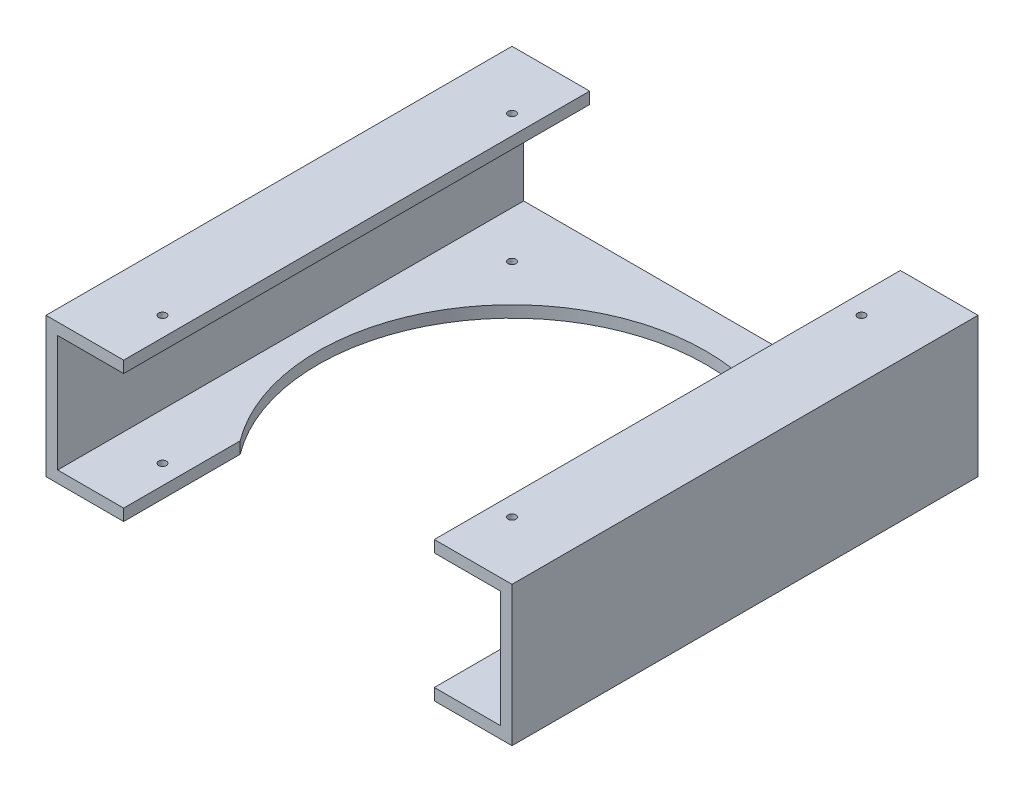
ISO-10303-21;
HEADER;
FILE_DESCRIPTION(('STEP AP214'),'2;1');
FILE_NAME('part.step','',(''),(''),'','','');
FILE_SCHEMA(('AUTOMOTIVE_DESIGN { 1 0 10303 214 1 1 1 1 }'));
ENDSEC;
DATA;
#1=APPLICATION_CONTEXT('core data for automotive mechanical design processes');
#2=APPLICATION_PROTOCOL_DEFINITION('international standard','automotive_design',2000,#1);
#3=PRODUCT_CONTEXT('',#1,'mechanical');
#4=PRODUCT('Part','Part','',(#3));
#5=PRODUCT_RELATED_PRODUCT_CATEGORY('part','',(#4));
#6=PRODUCT_DEFINITION_FORMATION('','',#4);
#7=PRODUCT_DEFINITION_CONTEXT('part definition',#1,'design');
#8=PRODUCT_DEFINITION('design','',#6,#7);
#9=PRODUCT_DEFINITION_SHAPE('','',#8);
#10=(LENGTH_UNIT() NAMED_UNIT(*) SI_UNIT(.MILLI.,.METRE.));
#11=(NAMED_UNIT(*) PLANE_ANGLE_UNIT() SI_UNIT($,.RADIAN.));
#12=(NAMED_UNIT(*) SI_UNIT($,.STERADIAN.) SOLID_ANGLE_UNIT());
#13=UNCERTAINTY_MEASURE_WITH_UNIT(LENGTH_MEASURE(1.E-05),#10,'distance_accuracy_value','');
#14=(GEOMETRIC_REPRESENTATION_CONTEXT(3) GLOBAL_UNCERTAINTY_ASSIGNED_CONTEXT((#13)) GLOBAL_UNIT_ASSIGNED_CONTEXT((#10,
#11,#12)) REPRESENTATION_CONTEXT('',''));
#15=CARTESIAN_POINT('',(0.,0.,0.));
#16=DIRECTION('',(0.,0.,1.));
#17=DIRECTION('',(1.,0.,0.));
#18=AXIS2_PLACEMENT_3D('',#15,#16,#17);
#19=CARTESIAN_POINT('',(0.,0.,60.));
#20=DIRECTION('',(0.,0.,1.));
#21=DIRECTION('',(1.,0.,0.));
#22=AXIS2_PLACEMENT_3D('',#19,#20,#21);
#23=PLANE('',#22);
#24=DIRECTION('',(0.,1.,0.));
#25=VECTOR('',#24,1.);
#26=CARTESIAN_POINT('',(-40.,18.001,60.));
#27=LINE('',#26,#25);
#28=CARTESIAN_POINT('',(-40.,-18.,60.));
#29=VERTEX_POINT('',#28);
#30=CARTESIAN_POINT('',(-40.,-15.,60.));
#31=VERTEX_POINT('',#30);
#32=EDGE_CURVE('E315',#29,#31,#27,.T.);
#33=ORIENTED_EDGE('',*,*,#32,.T.);
#34=DIRECTION('',(1.,0.,0.));
#35=VECTOR('',#34,1.);
#36=CARTESIAN_POINT('',(57.,-15.,60.));
#37=LINE('',#36,#35);
#38=CARTESIAN_POINT('',(-57.,-15.,60.));
#39=VERTEX_POINT('',#38);
#40=EDGE_CURVE('E169',#39,#31,#37,.T.);
#41=ORIENTED_EDGE('',*,*,#40,.F.);
#42=DIRECTION('',(0.,-1.,0.));
#43=VECTOR('',#42,1.);
#44=CARTESIAN_POINT('',(-57.,-15.,60.));
#45=LINE('',#44,#43);
#46=CARTESIAN_POINT('',(-57.,15.,60.));
#47=VERTEX_POINT('',#46);
#48=EDGE_CURVE('E193',#47,#39,#45,.T.);
#49=ORIENTED_EDGE('',*,*,#48,.F.);
#50=DIRECTION('',(-1.,0.,0.));
#51=VECTOR('',#50,1.);
#52=CARTESIAN_POINT('',(57.,15.,60.));
#53=LINE('',#52,#51);
#54=CARTESIAN_POINT('',(-40.,15.,60.));
#55=VERTEX_POINT('',#54);
#56=EDGE_CURVE('E215',#55,#47,#53,.T.);
#57=ORIENTED_EDGE('',*,*,#56,.F.);
#58=DIRECTION('',(0.,-1.,0.));
#59=VECTOR('',#58,1.);
#60=CARTESIAN_POINT('',(-40.,3.82109309296091,60.));
#61=LINE('',#60,#59);
#62=CARTESIAN_POINT('',(-40.,18.,60.));
#63=VERTEX_POINT('',#62);
#64=EDGE_CURVE('E175',#63,#55,#61,.T.);
#65=ORIENTED_EDGE('',*,*,#64,.F.);
#66=DIRECTION('',(-1.,0.,0.));
#67=VECTOR('',#66,1.);
#68=CARTESIAN_POINT('',(60.,18.,60.));
#69=LINE('',#68,#67);
#70=CARTESIAN_POINT('',(-60.,18.,60.));
#71=VERTEX_POINT('',#70);
#72=EDGE_CURVE('E237',#63,#71,#69,.T.);
#73=ORIENTED_EDGE('',*,*,#72,.T.);
#74=DIRECTION('',(0.,-1.,0.));
#75=VECTOR('',#74,1.);
#76=CARTESIAN_POINT('',(-60.,-18.,60.));
#77=LINE('',#76,#75);
#78=CARTESIAN_POINT('',(-60.,-18.,60.));
#79=VERTEX_POINT('',#78);
#80=EDGE_CURVE('E221',#71,#79,#77,.T.);
#81=ORIENTED_EDGE('',*,*,#80,.T.);
#82=DIRECTION('',(1.,0.,0.));
#83=VECTOR('',#82,1.);
#84=CARTESIAN_POINT('',(60.,-18.,60.));
#85=LINE('',#84,#83);
#86=EDGE_CURVE('E231',#79,#29,#85,.T.);
#87=ORIENTED_EDGE('',*,*,#86,.T.);
#88=EDGE_LOOP('',(#33,#41,#49,#57,#65,#73,#81,#87));
#89=FACE_BOUND('',#88,.T.);
#90=ADVANCED_FACE('F38',(#89),#23,.T.);
#91=CARTESIAN_POINT('',(60.,18.,-60.));
#92=DIRECTION('',(0.,1.,0.));
#93=DIRECTION('',(-1.,0.,0.));
#94=AXIS2_PLACEMENT_3D('',#91,#92,#93);
#95=PLANE('',#94);
#96=CARTESIAN_POINT('',(-45.,18.,-45.));
#97=DIRECTION('',(0.,-1.,0.));
#98=DIRECTION('',(1.,0.,0.));
#99=AXIS2_PLACEMENT_3D('',#96,#97,#98);
#100=CIRCLE('',#99,0.999999999999998);
#101=CARTESIAN_POINT('',(-44.,18.,-45.));
#102=VERTEX_POINT('',#101);
#103=EDGE_CURVE('E294',#102,#102,#100,.T.);
#104=ORIENTED_EDGE('',*,*,#103,.T.);
#105=EDGE_LOOP('',(#104));
#106=FACE_BOUND('',#105,.T.);
#107=CARTESIAN_POINT('',(-45.,18.,45.));
#108=DIRECTION('',(0.,-1.,0.));
#109=DIRECTION('',(1.,0.,0.));
#110=AXIS2_PLACEMENT_3D('',#107,#108,#109);
#111=CIRCLE('',#110,0.999999999999998);
#112=CARTESIAN_POINT('',(-44.,18.,45.));
#113=VERTEX_POINT('',#112);
#114=EDGE_CURVE('E270',#113,#113,#111,.T.);
#115=ORIENTED_EDGE('',*,*,#114,.T.);
#116=EDGE_LOOP('',(#115));
#117=FACE_BOUND('',#116,.T.);
#118=DIRECTION('',(0.,0.,1.));
#119=VECTOR('',#118,1.);
#120=CARTESIAN_POINT('',(-40.,18.,-60.));
#121=LINE('',#120,#119);
#122=CARTESIAN_POINT('',(-40.,18.,-60.));
#123=VERTEX_POINT('',#122);
#124=EDGE_CURVE('E191',#123,#63,#121,.T.);
#125=ORIENTED_EDGE('',*,*,#124,.F.);
#126=DIRECTION('',(-1.,0.,0.));
#127=VECTOR('',#126,1.);
#128=CARTESIAN_POINT('',(60.,18.,-60.));
#129=LINE('',#128,#127);
#130=CARTESIAN_POINT('',(-60.,18.,-60.));
#131=VERTEX_POINT('',#130);
#132=EDGE_CURVE('E250',#123,#131,#129,.T.);
#133=ORIENTED_EDGE('',*,*,#132,.T.);
#134=DIRECTION('',(0.,0.,1.));
#135=VECTOR('',#134,1.);
#136=CARTESIAN_POINT('',(-60.,18.,-60.));
#137=LINE('',#136,#135);
#138=EDGE_CURVE('E255',#131,#71,#137,.T.);
#139=ORIENTED_EDGE('',*,*,#138,.T.);
#140=ORIENTED_EDGE('',*,*,#72,.F.);
#141=EDGE_LOOP('',(#125,#133,#139,#140));
#142=FACE_BOUND('',#141,.T.);
#143=ADVANCED_FACE('F379',(#106,#117,#142),#95,.T.);
#144=CARTESIAN_POINT('',(57.,15.,-60.));
#145=DIRECTION('',(0.,1.,0.));
#146=DIRECTION('',(0.,0.,1.));
#147=AXIS2_PLACEMENT_3D('',#144,#145,#146);
#148=PLANE('',#147);
#149=CARTESIAN_POINT('',(-45.,15.,-45.));
#150=DIRECTION('',(0.,1.,0.));
#151=DIRECTION('',(0.,0.,1.));
#152=AXIS2_PLACEMENT_3D('',#149,#150,#151);
#153=CIRCLE('',#152,0.999999999999998);
#154=CARTESIAN_POINT('',(-45.,15.,-44.));
#155=VERTEX_POINT('',#154);
#156=EDGE_CURVE('E173',#155,#155,#153,.T.);
#157=ORIENTED_EDGE('',*,*,#156,.T.);
#158=EDGE_LOOP('',(#157));
#159=FACE_BOUND('',#158,.T.);
#160=CARTESIAN_POINT('',(-45.,15.,45.));
#161=DIRECTION('',(0.,1.,0.));
#162=DIRECTION('',(0.,0.,1.));
#163=AXIS2_PLACEMENT_3D('',#160,#161,#162);
#164=CIRCLE('',#163,0.999999999999998);
#165=CARTESIAN_POINT('',(-45.,15.,46.));
#166=VERTEX_POINT('',#165);
#167=EDGE_CURVE('E269',#166,#166,#164,.T.);
#168=ORIENTED_EDGE('',*,*,#167,.T.);
#169=EDGE_LOOP('',(#168));
#170=FACE_BOUND('',#169,.T.);
#171=DIRECTION('',(-1.,0.,0.));
#172=VECTOR('',#171,1.);
#173=CARTESIAN_POINT('',(57.,15.,-60.));
#174=LINE('',#173,#172);
#175=CARTESIAN_POINT('',(-40.,15.,-60.));
#176=VERTEX_POINT('',#175);
#177=CARTESIAN_POINT('',(-57.,15.,-60.));
#178=VERTEX_POINT('',#177);
#179=EDGE_CURVE('E204',#176,#178,#174,.T.);
#180=ORIENTED_EDGE('',*,*,#179,.F.);
#181=DIRECTION('',(0.,0.,1.));
#182=VECTOR('',#181,1.);
#183=CARTESIAN_POINT('',(-40.,15.,-60.));
#184=LINE('',#183,#182);
#185=EDGE_CURVE('E11',#176,#55,#184,.T.);
#186=ORIENTED_EDGE('',*,*,#185,.T.);
#187=ORIENTED_EDGE('',*,*,#56,.T.);
#188=DIRECTION('',(0.,0.,1.));
#189=VECTOR('',#188,1.);
#190=CARTESIAN_POINT('',(-57.,15.,-60.));
#191=LINE('',#190,#189);
#192=EDGE_CURVE('E218',#178,#47,#191,.T.);
#193=ORIENTED_EDGE('',*,*,#192,.F.);
#194=EDGE_LOOP('',(#180,#186,#187,#193));
#195=FACE_BOUND('',#194,.T.);
#196=ADVANCED_FACE('F386',(#159,#170,#195),#148,.F.);
#197=CARTESIAN_POINT('',(-60.,-18.,-60.));
#198=DIRECTION('',(-1.,0.,0.));
#199=DIRECTION('',(0.,0.,1.));
#200=AXIS2_PLACEMENT_3D('',#197,#198,#199);
#201=PLANE('',#200);
#202=DIRECTION('',(0.,0.,1.));
#203=VECTOR('',#202,1.);
#204=CARTESIAN_POINT('',(-60.,-18.,-60.));
#205=LINE('',#204,#203);
#206=CARTESIAN_POINT('',(-60.,-18.,-60.));
#207=VERTEX_POINT('',#206);
#208=EDGE_CURVE('E254',#207,#79,#205,.T.);
#209=ORIENTED_EDGE('',*,*,#208,.T.);
#210=ORIENTED_EDGE('',*,*,#80,.F.);
#211=ORIENTED_EDGE('',*,*,#138,.F.);
#212=DIRECTION('',(0.,-1.,0.));
#213=VECTOR('',#212,1.);
#214=CARTESIAN_POINT('',(-60.,-18.,-60.));
#215=LINE('',#214,#213);
#216=EDGE_CURVE('E241',#131,#207,#215,.T.);
#217=ORIENTED_EDGE('',*,*,#216,.T.);
#218=EDGE_LOOP('',(#209,#210,#211,#217));
#219=FACE_BOUND('',#218,.T.);
#220=ADVANCED_FACE('F40',(#219),#201,.T.);
#221=CARTESIAN_POINT('',(45.,18.,-45.));
#222=DIRECTION('',(0.,-1.,0.));
#223=DIRECTION('',(1.,0.,0.));
#224=AXIS2_PLACEMENT_3D('',#221,#222,#223);
#225=CIRCLE('',#224,0.999999999999998);
#226=CARTESIAN_POINT('',(46.,18.,-45.));
#227=VERTEX_POINT('',#226);
#228=EDGE_CURVE('E301',#227,#227,#225,.T.);
#229=ORIENTED_EDGE('',*,*,#228,.T.);
#230=EDGE_LOOP('',(#229));
#231=FACE_BOUND('',#230,.T.);
#232=CARTESIAN_POINT('',(45.,18.,45.));
#233=DIRECTION('',(0.,-1.,0.));
#234=DIRECTION('',(1.,0.,0.));
#235=AXIS2_PLACEMENT_3D('',#232,#233,#234);
#236=CIRCLE('',#235,0.999999999999998);
#237=CARTESIAN_POINT('',(46.,18.,45.));
#238=VERTEX_POINT('',#237);
#239=EDGE_CURVE('E307',#238,#238,#236,.T.);
#240=ORIENTED_EDGE('',*,*,#239,.T.);
#241=EDGE_LOOP('',(#240));
#242=FACE_BOUND('',#241,.T.);
#243=DIRECTION('',(0.,0.,-1.));
#244=VECTOR('',#243,1.);
#245=CARTESIAN_POINT('',(40.,18.,-60.));
#246=LINE('',#245,#244);
#247=CARTESIAN_POINT('',(40.,18.,60.));
#248=VERTEX_POINT('',#247);
#249=CARTESIAN_POINT('',(40.,18.,-60.));
#250=VERTEX_POINT('',#249);
#251=EDGE_CURVE('E187',#248,#250,#246,.T.);
#252=ORIENTED_EDGE('',*,*,#251,.F.);
#253=CARTESIAN_POINT('',(60.,18.,60.));
#254=VERTEX_POINT('',#253);
#255=EDGE_CURVE('E238',#254,#248,#69,.T.);
#256=ORIENTED_EDGE('',*,*,#255,.F.);
#257=DIRECTION('',(0.,0.,1.));
#258=VECTOR('',#257,1.);
#259=CARTESIAN_POINT('',(60.,18.,-60.));
#260=LINE('',#259,#258);
#261=CARTESIAN_POINT('',(60.,18.,-60.));
#262=VERTEX_POINT('',#261);
#263=EDGE_CURVE('E258',#262,#254,#260,.T.);
#264=ORIENTED_EDGE('',*,*,#263,.F.);
#265=EDGE_CURVE('E251',#262,#250,#129,.T.);
#266=ORIENTED_EDGE('',*,*,#265,.T.);
#267=EDGE_LOOP('',(#252,#256,#264,#266));
#268=FACE_BOUND('',#267,.T.);
#269=ADVANCED_FACE('F362',(#231,#242,#268),#95,.T.);
#270=CARTESIAN_POINT('',(60.,-18.,-60.));
#271=DIRECTION('',(1.,0.,0.));
#272=DIRECTION('',(0.,0.,-1.));
#273=AXIS2_PLACEMENT_3D('',#270,#271,#272);
#274=PLANE('',#273);
#275=ORIENTED_EDGE('',*,*,#263,.T.);
#276=DIRECTION('',(0.,1.,0.));
#277=VECTOR('',#276,1.);
#278=CARTESIAN_POINT('',(60.,-18.,60.));
#279=LINE('',#278,#277);
#280=CARTESIAN_POINT('',(60.,-18.,60.));
#281=VERTEX_POINT('',#280);
#282=EDGE_CURVE('E234',#281,#254,#279,.T.);
#283=ORIENTED_EDGE('',*,*,#282,.F.);
#284=DIRECTION('',(0.,0.,1.));
#285=VECTOR('',#284,1.);
#286=CARTESIAN_POINT('',(60.,-18.,-60.));
#287=LINE('',#286,#285);
#288=CARTESIAN_POINT('',(60.,-18.,-60.));
#289=VERTEX_POINT('',#288);
#290=EDGE_CURVE('E260',#289,#281,#287,.T.);
#291=ORIENTED_EDGE('',*,*,#290,.F.);
#292=DIRECTION('',(0.,1.,0.));
#293=VECTOR('',#292,1.);
#294=CARTESIAN_POINT('',(60.,-18.,-60.));
#295=LINE('',#294,#293);
#296=EDGE_CURVE('E247',#289,#262,#295,.T.);
#297=ORIENTED_EDGE('',*,*,#296,.T.);
#298=EDGE_LOOP('',(#275,#283,#291,#297));
#299=FACE_BOUND('',#298,.T.);
#300=ADVANCED_FACE('F359',(#299),#274,.T.);
#301=CARTESIAN_POINT('',(60.,-18.,-60.));
#302=DIRECTION('',(0.,-1.,0.));
#303=DIRECTION('',(1.,0.,0.));
#304=AXIS2_PLACEMENT_3D('',#301,#302,#303);
#305=PLANE('',#304);
#306=DIRECTION('',(0.,0.,-1.));
#307=VECTOR('',#306,1.);
#308=CARTESIAN_POINT('',(-40.,-18.,90.));
#309=LINE('',#308,#307);
#310=CARTESIAN_POINT('',(-40.,-18.,30.));
#311=VERTEX_POINT('',#310);
#312=EDGE_CURVE('E63',#29,#311,#309,.T.);
#313=ORIENTED_EDGE('',*,*,#312,.F.);
#314=ORIENTED_EDGE('',*,*,#86,.F.);
#315=ORIENTED_EDGE('',*,*,#208,.F.);
#316=DIRECTION('',(1.,0.,0.));
#317=VECTOR('',#316,1.);
#318=CARTESIAN_POINT('',(60.,-18.,-60.));
#319=LINE('',#318,#317);
#320=EDGE_CURVE('E244',#207,#289,#319,.T.);
#321=ORIENTED_EDGE('',*,*,#320,.T.);
#322=ORIENTED_EDGE('',*,*,#290,.T.);
#323=CARTESIAN_POINT('',(40.,-18.,60.));
#324=VERTEX_POINT('',#323);
#325=EDGE_CURVE('E230',#324,#281,#85,.T.);
#326=ORIENTED_EDGE('',*,*,#325,.F.);
#327=DIRECTION('',(0.,0.,1.));
#328=VECTOR('',#327,1.);
#329=CARTESIAN_POINT('',(40.,-18.,90.));
#330=LINE('',#329,#328);
#331=CARTESIAN_POINT('',(40.,-18.,30.));
#332=VERTEX_POINT('',#331);
#333=EDGE_CURVE('E298',#332,#324,#330,.T.);
#334=ORIENTED_EDGE('',*,*,#333,.F.);
#335=CARTESIAN_POINT('',(0.,-18.,0.));
#336=DIRECTION('',(0.,1.,0.));
#337=DIRECTION('',(0.,0.,1.));
#338=AXIS2_PLACEMENT_3D('',#335,#336,#337);
#339=CIRCLE('',#338,50.);
#340=EDGE_CURVE('E172',#332,#311,#339,.T.);
#341=ORIENTED_EDGE('',*,*,#340,.T.);
#342=EDGE_LOOP('',(#313,#314,#315,#321,#322,#326,#334,#341));
#343=FACE_BOUND('',#342,.T.);
#344=CARTESIAN_POINT('',(-45.,-18.,-45.));
#345=DIRECTION('',(0.,-1.,0.));
#346=DIRECTION('',(1.,0.,0.));
#347=AXIS2_PLACEMENT_3D('',#344,#345,#346);
#348=CIRCLE('',#347,0.999999999999998);
#349=CARTESIAN_POINT('',(-44.,-18.,-45.));
#350=VERTEX_POINT('',#349);
#351=EDGE_CURVE('E297',#350,#350,#348,.T.);
#352=ORIENTED_EDGE('',*,*,#351,.F.);
#353=EDGE_LOOP('',(#352));
#354=FACE_BOUND('',#353,.T.);
#355=CARTESIAN_POINT('',(45.,-18.,-45.));
#356=DIRECTION('',(0.,-1.,0.));
#357=DIRECTION('',(1.,0.,0.));
#358=AXIS2_PLACEMENT_3D('',#355,#356,#357);
#359=CIRCLE('',#358,0.999999999999998);
#360=CARTESIAN_POINT('',(46.,-18.,-45.));
#361=VERTEX_POINT('',#360);
#362=EDGE_CURVE('E304',#361,#361,#359,.T.);
#363=ORIENTED_EDGE('',*,*,#362,.F.);
#364=EDGE_LOOP('',(#363));
#365=FACE_BOUND('',#364,.T.);
#366=CARTESIAN_POINT('',(45.,-18.,45.));
#367=DIRECTION('',(0.,-1.,0.));
#368=DIRECTION('',(1.,0.,0.));
#369=AXIS2_PLACEMENT_3D('',#366,#367,#368);
#370=CIRCLE('',#369,0.999999999999998);
#371=CARTESIAN_POINT('',(46.,-18.,45.));
#372=VERTEX_POINT('',#371);
#373=EDGE_CURVE('E291',#372,#372,#370,.T.);
#374=ORIENTED_EDGE('',*,*,#373,.F.);
#375=EDGE_LOOP('',(#374));
#376=FACE_BOUND('',#375,.T.);
#377=CARTESIAN_POINT('',(-45.,-18.,45.));
#378=DIRECTION('',(0.,-1.,0.));
#379=DIRECTION('',(1.,0.,0.));
#380=AXIS2_PLACEMENT_3D('',#377,#378,#379);
#381=CIRCLE('',#380,0.999999999999998);
#382=CARTESIAN_POINT('',(-44.,-18.,45.));
#383=VERTEX_POINT('',#382);
#384=EDGE_CURVE('E288',#383,#383,#381,.T.);
#385=ORIENTED_EDGE('',*,*,#384,.F.);
#386=EDGE_LOOP('',(#385));
#387=FACE_BOUND('',#386,.T.);
#388=ADVANCED_FACE('F323',(#343,#354,#365,#376,#387),#305,.T.);
#389=CARTESIAN_POINT('',(0.,0.,-60.));
#390=DIRECTION('',(0.,0.,1.));
#391=DIRECTION('',(1.,0.,0.));
#392=AXIS2_PLACEMENT_3D('',#389,#390,#391);
#393=PLANE('',#392);
#394=ORIENTED_EDGE('',*,*,#132,.F.);
#395=DIRECTION('',(0.,-1.,0.));
#396=VECTOR('',#395,1.);
#397=CARTESIAN_POINT('',(-40.,3.82109309296091,-60.));
#398=LINE('',#397,#396);
#399=EDGE_CURVE('E180',#123,#176,#398,.T.);
#400=ORIENTED_EDGE('',*,*,#399,.T.);
#401=ORIENTED_EDGE('',*,*,#179,.T.);
#402=DIRECTION('',(0.,-1.,0.));
#403=VECTOR('',#402,1.);
#404=CARTESIAN_POINT('',(-57.,-15.,-60.));
#405=LINE('',#404,#403);
#406=CARTESIAN_POINT('',(-57.,-15.,-60.));
#407=VERTEX_POINT('',#406);
#408=EDGE_CURVE('E194',#178,#407,#405,.T.);
#409=ORIENTED_EDGE('',*,*,#408,.T.);
#410=DIRECTION('',(1.,0.,0.));
#411=VECTOR('',#410,1.);
#412=CARTESIAN_POINT('',(57.,-15.,-60.));
#413=LINE('',#412,#411);
#414=CARTESIAN_POINT('',(57.,-15.,-60.));
#415=VERTEX_POINT('',#414);
#416=EDGE_CURVE('E197',#407,#415,#413,.T.);
#417=ORIENTED_EDGE('',*,*,#416,.T.);
#418=DIRECTION('',(0.,1.,0.));
#419=VECTOR('',#418,1.);
#420=CARTESIAN_POINT('',(57.,-15.,-60.));
#421=LINE('',#420,#419);
#422=CARTESIAN_POINT('',(57.,15.,-60.));
#423=VERTEX_POINT('',#422);
#424=EDGE_CURVE('E201',#415,#423,#421,.T.);
#425=ORIENTED_EDGE('',*,*,#424,.T.);
#426=CARTESIAN_POINT('',(40.,15.,-60.));
#427=VERTEX_POINT('',#426);
#428=EDGE_CURVE('E205',#423,#427,#174,.T.);
#429=ORIENTED_EDGE('',*,*,#428,.T.);
#430=DIRECTION('',(0.,1.,0.));
#431=VECTOR('',#430,1.);
#432=CARTESIAN_POINT('',(40.,3.82109309296091,-60.));
#433=LINE('',#432,#431);
#434=EDGE_CURVE('E183',#427,#250,#433,.T.);
#435=ORIENTED_EDGE('',*,*,#434,.T.);
#436=ORIENTED_EDGE('',*,*,#265,.F.);
#437=ORIENTED_EDGE('',*,*,#296,.F.);
#438=ORIENTED_EDGE('',*,*,#320,.F.);
#439=ORIENTED_EDGE('',*,*,#216,.F.);
#440=EDGE_LOOP('',(#394,#400,#401,#409,#417,#425,#429,#435,#436,#437,#438,#439));
#441=FACE_BOUND('',#440,.T.);
#442=ADVANCED_FACE('F342',(#441),#393,.F.);
#443=DIRECTION('',(0.,-1.,0.));
#444=VECTOR('',#443,1.);
#445=CARTESIAN_POINT('',(40.,18.001,60.));
#446=LINE('',#445,#444);
#447=CARTESIAN_POINT('',(40.,-15.,60.));
#448=VERTEX_POINT('',#447);
#449=EDGE_CURVE('E159',#448,#324,#446,.T.);
#450=ORIENTED_EDGE('',*,*,#449,.T.);
#451=ORIENTED_EDGE('',*,*,#325,.T.);
#452=ORIENTED_EDGE('',*,*,#282,.T.);
#453=ORIENTED_EDGE('',*,*,#255,.T.);
#454=DIRECTION('',(0.,1.,0.));
#455=VECTOR('',#454,1.);
#456=CARTESIAN_POINT('',(40.,3.82109309296091,60.));
#457=LINE('',#456,#455);
#458=CARTESIAN_POINT('',(40.,15.,60.));
#459=VERTEX_POINT('',#458);
#460=EDGE_CURVE('E184',#459,#248,#457,.T.);
#461=ORIENTED_EDGE('',*,*,#460,.F.);
#462=CARTESIAN_POINT('',(57.,15.,60.));
#463=VERTEX_POINT('',#462);
#464=EDGE_CURVE('E198',#463,#459,#53,.T.);
#465=ORIENTED_EDGE('',*,*,#464,.F.);
#466=DIRECTION('',(0.,1.,0.));
#467=VECTOR('',#466,1.);
#468=CARTESIAN_POINT('',(57.,-15.,60.));
#469=LINE('',#468,#467);
#470=CARTESIAN_POINT('',(57.,-15.,60.));
#471=VERTEX_POINT('',#470);
#472=EDGE_CURVE('E212',#471,#463,#469,.T.);
#473=ORIENTED_EDGE('',*,*,#472,.F.);
#474=EDGE_CURVE('E210',#448,#471,#37,.T.);
#475=ORIENTED_EDGE('',*,*,#474,.F.);
#476=EDGE_LOOP('',(#450,#451,#452,#453,#461,#465,#473,#475));
#477=FACE_BOUND('',#476,.T.);
#478=ADVANCED_FACE('F327',(#477),#23,.T.);
#479=CARTESIAN_POINT('',(-57.,-15.,-60.));
#480=DIRECTION('',(-1.,0.,0.));
#481=DIRECTION('',(0.,0.,1.));
#482=AXIS2_PLACEMENT_3D('',#479,#480,#481);
#483=PLANE('',#482);
#484=ORIENTED_EDGE('',*,*,#48,.T.);
#485=DIRECTION('',(0.,0.,1.));
#486=VECTOR('',#485,1.);
#487=CARTESIAN_POINT('',(-57.,-15.,-60.));
#488=LINE('',#487,#486);
#489=EDGE_CURVE('E208',#407,#39,#488,.T.);
#490=ORIENTED_EDGE('',*,*,#489,.F.);
#491=ORIENTED_EDGE('',*,*,#408,.F.);
#492=ORIENTED_EDGE('',*,*,#192,.T.);
#493=EDGE_LOOP('',(#484,#490,#491,#492));
#494=FACE_BOUND('',#493,.T.);
#495=ADVANCED_FACE('F392',(#494),#483,.F.);
#496=CARTESIAN_POINT('',(45.,15.,-45.));
#497=DIRECTION('',(0.,1.,0.));
#498=DIRECTION('',(0.,0.,1.));
#499=AXIS2_PLACEMENT_3D('',#496,#497,#498);
#500=CIRCLE('',#499,0.999999999999998);
#501=CARTESIAN_POINT('',(45.,15.,-44.));
#502=VERTEX_POINT('',#501);
#503=EDGE_CURVE('E276',#502,#502,#500,.T.);
#504=ORIENTED_EDGE('',*,*,#503,.T.);
#505=EDGE_LOOP('',(#504));
#506=FACE_BOUND('',#505,.T.);
#507=CARTESIAN_POINT('',(45.,15.,45.));
#508=DIRECTION('',(0.,1.,0.));
#509=DIRECTION('',(0.,0.,1.));
#510=AXIS2_PLACEMENT_3D('',#507,#508,#509);
#511=CIRCLE('',#510,0.999999999999998);
#512=CARTESIAN_POINT('',(45.,15.,46.));
#513=VERTEX_POINT('',#512);
#514=EDGE_CURVE('E273',#513,#513,#511,.T.);
#515=ORIENTED_EDGE('',*,*,#514,.T.);
#516=EDGE_LOOP('',(#515));
#517=FACE_BOUND('',#516,.T.);
#518=ORIENTED_EDGE('',*,*,#464,.T.);
#519=DIRECTION('',(0.,0.,-1.));
#520=VECTOR('',#519,1.);
#521=CARTESIAN_POINT('',(40.,15.,-60.));
#522=LINE('',#521,#520);
#523=EDGE_CURVE('E47',#459,#427,#522,.T.);
#524=ORIENTED_EDGE('',*,*,#523,.T.);
#525=ORIENTED_EDGE('',*,*,#428,.F.);
#526=DIRECTION('',(0.,0.,1.));
#527=VECTOR('',#526,1.);
#528=CARTESIAN_POINT('',(57.,15.,-60.));
#529=LINE('',#528,#527);
#530=EDGE_CURVE('E222',#423,#463,#529,.T.);
#531=ORIENTED_EDGE('',*,*,#530,.T.);
#532=EDGE_LOOP('',(#518,#524,#525,#531));
#533=FACE_BOUND('',#532,.T.);
#534=ADVANCED_FACE('F338',(#506,#517,#533),#148,.F.);
#535=CARTESIAN_POINT('',(57.,-15.,-60.));
#536=DIRECTION('',(1.,0.,0.));
#537=DIRECTION('',(0.,0.,-1.));
#538=AXIS2_PLACEMENT_3D('',#535,#536,#537);
#539=PLANE('',#538);
#540=ORIENTED_EDGE('',*,*,#472,.T.);
#541=ORIENTED_EDGE('',*,*,#530,.F.);
#542=ORIENTED_EDGE('',*,*,#424,.F.);
#543=DIRECTION('',(0.,0.,1.));
#544=VECTOR('',#543,1.);
#545=CARTESIAN_POINT('',(57.,-15.,-60.));
#546=LINE('',#545,#544);
#547=EDGE_CURVE('E224',#415,#471,#546,.T.);
#548=ORIENTED_EDGE('',*,*,#547,.T.);
#549=EDGE_LOOP('',(#540,#541,#542,#548));
#550=FACE_BOUND('',#549,.T.);
#551=ADVANCED_FACE('F334',(#550),#539,.F.);
#552=CARTESIAN_POINT('',(57.,-15.,-60.));
#553=DIRECTION('',(0.,-1.,0.));
#554=DIRECTION('',(0.,0.,-1.));
#555=AXIS2_PLACEMENT_3D('',#552,#553,#554);
#556=PLANE('',#555);
#557=CARTESIAN_POINT('',(-45.,-15.,-45.));
#558=DIRECTION('',(0.,-1.,0.));
#559=DIRECTION('',(0.,0.,-1.));
#560=AXIS2_PLACEMENT_3D('',#557,#558,#559);
#561=CIRCLE('',#560,0.999999999999998);
#562=CARTESIAN_POINT('',(-45.,-15.,-46.));
#563=VERTEX_POINT('',#562);
#564=EDGE_CURVE('E42',#563,#563,#561,.T.);
#565=ORIENTED_EDGE('',*,*,#564,.T.);
#566=EDGE_LOOP('',(#565));
#567=FACE_BOUND('',#566,.T.);
#568=CARTESIAN_POINT('',(45.,-15.,-45.));
#569=DIRECTION('',(0.,-1.,0.));
#570=DIRECTION('',(0.,0.,-1.));
#571=AXIS2_PLACEMENT_3D('',#568,#569,#570);
#572=CIRCLE('',#571,0.999999999999998);
#573=CARTESIAN_POINT('',(45.,-15.,-46.));
#574=VERTEX_POINT('',#573);
#575=EDGE_CURVE('E274',#574,#574,#572,.T.);
#576=ORIENTED_EDGE('',*,*,#575,.T.);
#577=EDGE_LOOP('',(#576));
#578=FACE_BOUND('',#577,.T.);
#579=CARTESIAN_POINT('',(45.,-15.,45.));
#580=DIRECTION('',(0.,-1.,0.));
#581=DIRECTION('',(0.,0.,-1.));
#582=AXIS2_PLACEMENT_3D('',#579,#580,#581);
#583=CIRCLE('',#582,0.999999999999998);
#584=CARTESIAN_POINT('',(45.,-15.,44.));
#585=VERTEX_POINT('',#584);
#586=EDGE_CURVE('E271',#585,#585,#583,.T.);
#587=ORIENTED_EDGE('',*,*,#586,.T.);
#588=EDGE_LOOP('',(#587));
#589=FACE_BOUND('',#588,.T.);
#590=CARTESIAN_POINT('',(-45.,-15.,45.));
#591=DIRECTION('',(0.,-1.,0.));
#592=DIRECTION('',(0.,0.,-1.));
#593=AXIS2_PLACEMENT_3D('',#590,#591,#592);
#594=CIRCLE('',#593,0.999999999999998);
#595=CARTESIAN_POINT('',(-45.,-15.,44.));
#596=VERTEX_POINT('',#595);
#597=EDGE_CURVE('E266',#596,#596,#594,.T.);
#598=ORIENTED_EDGE('',*,*,#597,.T.);
#599=EDGE_LOOP('',(#598));
#600=FACE_BOUND('',#599,.T.);
#601=ORIENTED_EDGE('',*,*,#40,.T.);
#602=DIRECTION('',(0.,0.,1.));
#603=VECTOR('',#602,1.);
#604=CARTESIAN_POINT('',(-40.,-15.,90.));
#605=LINE('',#604,#603);
#606=CARTESIAN_POINT('',(-40.,-15.,30.));
#607=VERTEX_POINT('',#606);
#608=EDGE_CURVE('E153',#607,#31,#605,.T.);
#609=ORIENTED_EDGE('',*,*,#608,.F.);
#610=CARTESIAN_POINT('',(0.,-15.,0.));
#611=DIRECTION('',(0.,1.,0.));
#612=DIRECTION('',(0.,0.,1.));
#613=AXIS2_PLACEMENT_3D('',#610,#611,#612);
#614=CIRCLE('',#613,50.);
#615=CARTESIAN_POINT('',(40.,-15.,30.));
#616=VERTEX_POINT('',#615);
#617=EDGE_CURVE('E166',#616,#607,#614,.T.);
#618=ORIENTED_EDGE('',*,*,#617,.F.);
#619=DIRECTION('',(0.,0.,-1.));
#620=VECTOR('',#619,1.);
#621=CARTESIAN_POINT('',(40.,-15.,90.));
#622=LINE('',#621,#620);
#623=EDGE_CURVE('E55',#448,#616,#622,.T.);
#624=ORIENTED_EDGE('',*,*,#623,.F.);
#625=ORIENTED_EDGE('',*,*,#474,.T.);
#626=ORIENTED_EDGE('',*,*,#547,.F.);
#627=ORIENTED_EDGE('',*,*,#416,.F.);
#628=ORIENTED_EDGE('',*,*,#489,.T.);
#629=EDGE_LOOP('',(#601,#609,#618,#624,#625,#626,#627,#628));
#630=FACE_BOUND('',#629,.T.);
#631=ADVANCED_FACE('F165',(#567,#578,#589,#600,#630),#556,.F.);
#632=CARTESIAN_POINT('',(40.,3.82109309296091,-60.));
#633=DIRECTION('',(1.,0.,0.));
#634=DIRECTION('',(0.,1.,0.));
#635=AXIS2_PLACEMENT_3D('',#632,#633,#634);
#636=PLANE('',#635);
#637=ORIENTED_EDGE('',*,*,#251,.T.);
#638=ORIENTED_EDGE('',*,*,#434,.F.);
#639=ORIENTED_EDGE('',*,*,#523,.F.);
#640=ORIENTED_EDGE('',*,*,#460,.T.);
#641=EDGE_LOOP('',(#637,#638,#639,#640));
#642=FACE_BOUND('',#641,.T.);
#643=ADVANCED_FACE('F364',(#642),#636,.F.);
#644=CARTESIAN_POINT('',(-40.,3.82109309296091,-60.));
#645=DIRECTION('',(-1.,0.,0.));
#646=DIRECTION('',(0.,-1.,0.));
#647=AXIS2_PLACEMENT_3D('',#644,#645,#646);
#648=PLANE('',#647);
#649=ORIENTED_EDGE('',*,*,#124,.T.);
#650=ORIENTED_EDGE('',*,*,#64,.T.);
#651=ORIENTED_EDGE('',*,*,#185,.F.);
#652=ORIENTED_EDGE('',*,*,#399,.F.);
#653=EDGE_LOOP('',(#649,#650,#651,#652));
#654=FACE_BOUND('',#653,.T.);
#655=ADVANCED_FACE('F366',(#654),#648,.F.);
#656=CARTESIAN_POINT('',(0.,-18.,0.));
#657=DIRECTION('',(0.,1.,0.));
#658=DIRECTION('',(0.,0.,1.));
#659=AXIS2_PLACEMENT_3D('',#656,#657,#658);
#660=CYLINDRICAL_SURFACE('',#659,50.);
#661=ORIENTED_EDGE('',*,*,#617,.T.);
#662=DIRECTION('',(0.,1.,0.));
#663=VECTOR('',#662,1.);
#664=CARTESIAN_POINT('',(-40.,-18.,30.));
#665=LINE('',#664,#663);
#666=EDGE_CURVE('E150',#311,#607,#665,.T.);
#667=ORIENTED_EDGE('',*,*,#666,.F.);
#668=ORIENTED_EDGE('',*,*,#340,.F.);
#669=DIRECTION('',(0.,1.,0.));
#670=VECTOR('',#669,1.);
#671=CARTESIAN_POINT('',(40.,-18.,30.));
#672=LINE('',#671,#670);
#673=EDGE_CURVE('E160',#616,#332,#672,.F.);
#674=ORIENTED_EDGE('',*,*,#673,.F.);
#675=EDGE_LOOP('',(#661,#667,#668,#674));
#676=FACE_BOUND('',#675,.T.);
#677=ADVANCED_FACE('F171',(#676),#660,.F.);
#678=CARTESIAN_POINT('',(-45.,18.,45.));
#679=DIRECTION('',(0.,-1.,0.));
#680=DIRECTION('',(1.,0.,0.));
#681=AXIS2_PLACEMENT_3D('',#678,#679,#680);
#682=CYLINDRICAL_SURFACE('',#681,0.999999999999998);
#683=ORIENTED_EDGE('',*,*,#384,.T.);
#684=EDGE_LOOP('',(#683));
#685=FACE_BOUND('',#684,.T.);
#686=ORIENTED_EDGE('',*,*,#597,.F.);
#687=EDGE_LOOP('',(#686));
#688=FACE_BOUND('',#687,.T.);
#689=ADVANCED_FACE('F465',(#685,#688),#682,.F.);
#690=CARTESIAN_POINT('',(45.,18.,45.));
#691=DIRECTION('',(0.,-1.,0.));
#692=DIRECTION('',(1.,0.,0.));
#693=AXIS2_PLACEMENT_3D('',#690,#691,#692);
#694=CYLINDRICAL_SURFACE('',#693,0.999999999999998);
#695=ORIENTED_EDGE('',*,*,#373,.T.);
#696=EDGE_LOOP('',(#695));
#697=FACE_BOUND('',#696,.T.);
#698=ORIENTED_EDGE('',*,*,#586,.F.);
#699=EDGE_LOOP('',(#698));
#700=FACE_BOUND('',#699,.T.);
#701=ADVANCED_FACE('F474',(#697,#700),#694,.F.);
#702=CARTESIAN_POINT('',(45.,18.,-45.));
#703=DIRECTION('',(0.,-1.,0.));
#704=DIRECTION('',(1.,0.,0.));
#705=AXIS2_PLACEMENT_3D('',#702,#703,#704);
#706=CYLINDRICAL_SURFACE('',#705,0.999999999999998);
#707=ORIENTED_EDGE('',*,*,#362,.T.);
#708=EDGE_LOOP('',(#707));
#709=FACE_BOUND('',#708,.T.);
#710=ORIENTED_EDGE('',*,*,#575,.F.);
#711=EDGE_LOOP('',(#710));
#712=FACE_BOUND('',#711,.T.);
#713=ADVANCED_FACE('F485',(#709,#712),#706,.F.);
#714=CARTESIAN_POINT('',(-45.,18.,-45.));
#715=DIRECTION('',(0.,-1.,0.));
#716=DIRECTION('',(1.,0.,0.));
#717=AXIS2_PLACEMENT_3D('',#714,#715,#716);
#718=CYLINDRICAL_SURFACE('',#717,0.999999999999998);
#719=ORIENTED_EDGE('',*,*,#351,.T.);
#720=EDGE_LOOP('',(#719));
#721=FACE_BOUND('',#720,.T.);
#722=ORIENTED_EDGE('',*,*,#564,.F.);
#723=EDGE_LOOP('',(#722));
#724=FACE_BOUND('',#723,.T.);
#725=ADVANCED_FACE('F496',(#721,#724),#718,.F.);
#726=ORIENTED_EDGE('',*,*,#239,.F.);
#727=EDGE_LOOP('',(#726));
#728=FACE_BOUND('',#727,.T.);
#729=ORIENTED_EDGE('',*,*,#514,.F.);
#730=EDGE_LOOP('',(#729));
#731=FACE_BOUND('',#730,.T.);
#732=ADVANCED_FACE('F488',(#728,#731),#694,.F.);
#733=ORIENTED_EDGE('',*,*,#228,.F.);
#734=EDGE_LOOP('',(#733));
#735=FACE_BOUND('',#734,.T.);
#736=ORIENTED_EDGE('',*,*,#503,.F.);
#737=EDGE_LOOP('',(#736));
#738=FACE_BOUND('',#737,.T.);
#739=ADVANCED_FACE('F499',(#735,#738),#706,.F.);
#740=ORIENTED_EDGE('',*,*,#114,.F.);
#741=EDGE_LOOP('',(#740));
#742=FACE_BOUND('',#741,.T.);
#743=ORIENTED_EDGE('',*,*,#167,.F.);
#744=EDGE_LOOP('',(#743));
#745=FACE_BOUND('',#744,.T.);
#746=ADVANCED_FACE('F477',(#742,#745),#682,.F.);
#747=ORIENTED_EDGE('',*,*,#103,.F.);
#748=EDGE_LOOP('',(#747));
#749=FACE_BOUND('',#748,.T.);
#750=ORIENTED_EDGE('',*,*,#156,.F.);
#751=EDGE_LOOP('',(#750));
#752=FACE_BOUND('',#751,.T.);
#753=ADVANCED_FACE('F509',(#749,#752),#718,.F.);
#754=CARTESIAN_POINT('',(40.,18.001,90.));
#755=DIRECTION('',(1.,0.,0.));
#756=DIRECTION('',(0.,1.,0.));
#757=AXIS2_PLACEMENT_3D('',#754,#755,#756);
#758=PLANE('',#757);
#759=ORIENTED_EDGE('',*,*,#623,.T.);
#760=ORIENTED_EDGE('',*,*,#673,.T.);
#761=ORIENTED_EDGE('',*,*,#333,.T.);
#762=ORIENTED_EDGE('',*,*,#449,.F.);
#763=EDGE_LOOP('',(#759,#760,#761,#762));
#764=FACE_BOUND('',#763,.T.);
#765=ADVANCED_FACE('F320',(#764),#758,.F.);
#766=CARTESIAN_POINT('',(-40.,18.001,90.));
#767=DIRECTION('',(-1.,0.,0.));
#768=DIRECTION('',(0.,-1.,0.));
#769=AXIS2_PLACEMENT_3D('',#766,#767,#768);
#770=PLANE('',#769);
#771=ORIENTED_EDGE('',*,*,#312,.T.);
#772=ORIENTED_EDGE('',*,*,#666,.T.);
#773=ORIENTED_EDGE('',*,*,#608,.T.);
#774=ORIENTED_EDGE('',*,*,#32,.F.);
#775=EDGE_LOOP('',(#771,#772,#773,#774));
#776=FACE_BOUND('',#775,.T.);
#777=ADVANCED_FACE('F152',(#776),#770,.F.);
#778=CLOSED_SHELL('',(#90,#143,#196,#220,#269,#300,#388,#442,#478,#495,#534,#551,#631,#643,#655,
#677,#689,#701,#713,#725,#732,#739,#746,#753,#765,#777));
#779=MANIFOLD_SOLID_BREP('B2',#778);
#780=ADVANCED_BREP_SHAPE_REPRESENTATION('',(#18,#779),#14);
#781=SHAPE_DEFINITION_REPRESENTATION(#9,#780);
ENDSEC;
END-ISO-10303-21;
